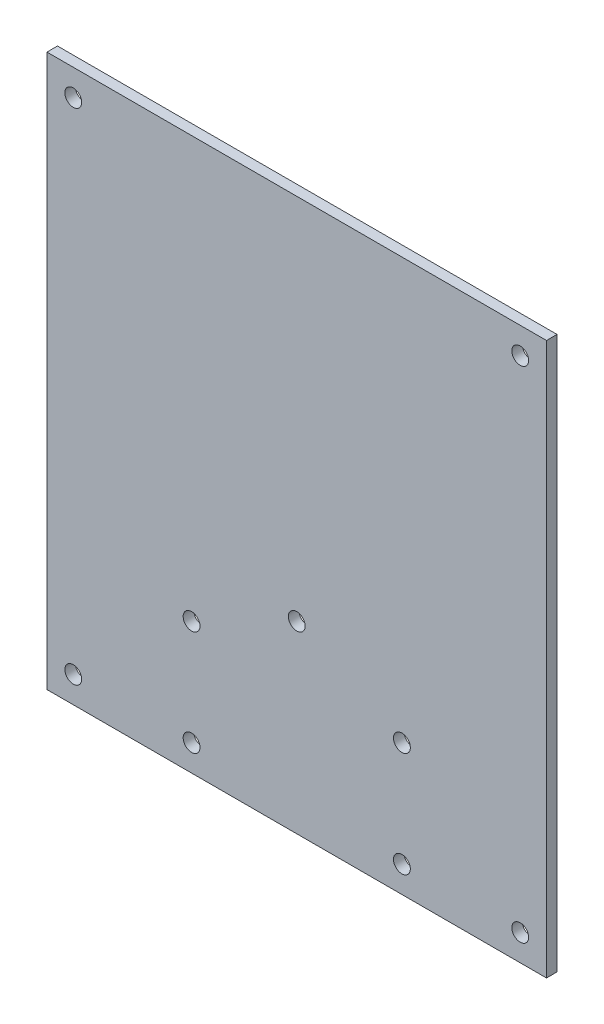
ISO-10303-21;
HEADER;
FILE_DESCRIPTION(('STEP AP214'),'2;1');
FILE_NAME('part.step','',(''),(''),'','','');
FILE_SCHEMA(('AUTOMOTIVE_DESIGN { 1 0 10303 214 1 1 1 1 }'));
ENDSEC;
DATA;
#1=APPLICATION_CONTEXT('core data for automotive mechanical design processes');
#2=APPLICATION_PROTOCOL_DEFINITION('international standard','automotive_design',2000,#1);
#3=PRODUCT_CONTEXT('',#1,'mechanical');
#4=PRODUCT('Part','Part','',(#3));
#5=PRODUCT_RELATED_PRODUCT_CATEGORY('part','',(#4));
#6=PRODUCT_DEFINITION_FORMATION('','',#4);
#7=PRODUCT_DEFINITION_CONTEXT('part definition',#1,'design');
#8=PRODUCT_DEFINITION('design','',#6,#7);
#9=PRODUCT_DEFINITION_SHAPE('','',#8);
#10=(LENGTH_UNIT() NAMED_UNIT(*) SI_UNIT(.MILLI.,.METRE.));
#11=(NAMED_UNIT(*) PLANE_ANGLE_UNIT() SI_UNIT($,.RADIAN.));
#12=(NAMED_UNIT(*) SI_UNIT($,.STERADIAN.) SOLID_ANGLE_UNIT());
#13=UNCERTAINTY_MEASURE_WITH_UNIT(LENGTH_MEASURE(1.E-05),#10,'distance_accuracy_value','');
#14=(GEOMETRIC_REPRESENTATION_CONTEXT(3) GLOBAL_UNCERTAINTY_ASSIGNED_CONTEXT((#13)) GLOBAL_UNIT_ASSIGNED_CONTEXT((#10,
#11,#12)) REPRESENTATION_CONTEXT('',''));
#15=CARTESIAN_POINT('',(0.,0.,0.));
#16=DIRECTION('',(0.,0.,1.));
#17=DIRECTION('',(1.,0.,0.));
#18=AXIS2_PLACEMENT_3D('',#15,#16,#17);
#19=CARTESIAN_POINT('',(-47.5,0.,2.));
#20=DIRECTION('',(-1.,0.,0.));
#21=DIRECTION('',(0.,0.,1.));
#22=AXIS2_PLACEMENT_3D('',#19,#20,#21);
#23=PLANE('',#22);
#24=DIRECTION('',(0.,1.,0.));
#25=VECTOR('',#24,1.);
#26=CARTESIAN_POINT('',(-47.5,0.,0.));
#27=LINE('',#26,#25);
#28=CARTESIAN_POINT('',(-47.5,0.,0.));
#29=VERTEX_POINT('',#28);
#30=CARTESIAN_POINT('',(-47.5,105.,0.));
#31=VERTEX_POINT('',#30);
#32=EDGE_CURVE('E126',#29,#31,#27,.T.);
#33=ORIENTED_EDGE('',*,*,#32,.F.);
#34=DIRECTION('',(0.,0.,-1.));
#35=VECTOR('',#34,1.);
#36=CARTESIAN_POINT('',(-47.5,0.,2.));
#37=LINE('',#36,#35);
#38=CARTESIAN_POINT('',(-47.5,0.,2.));
#39=VERTEX_POINT('',#38);
#40=EDGE_CURVE('E11',#39,#29,#37,.T.);
#41=ORIENTED_EDGE('',*,*,#40,.F.);
#42=DIRECTION('',(0.,1.,0.));
#43=VECTOR('',#42,1.);
#44=CARTESIAN_POINT('',(-47.5,0.,2.));
#45=LINE('',#44,#43);
#46=CARTESIAN_POINT('',(-47.5,105.,2.));
#47=VERTEX_POINT('',#46);
#48=EDGE_CURVE('E84',#39,#47,#45,.T.);
#49=ORIENTED_EDGE('',*,*,#48,.T.);
#50=DIRECTION('',(0.,0.,-1.));
#51=VECTOR('',#50,1.);
#52=CARTESIAN_POINT('',(-47.5,105.,2.));
#53=LINE('',#52,#51);
#54=EDGE_CURVE('E51',#47,#31,#53,.T.);
#55=ORIENTED_EDGE('',*,*,#54,.T.);
#56=EDGE_LOOP('',(#33,#41,#49,#55));
#57=FACE_BOUND('',#56,.T.);
#58=ADVANCED_FACE('F35',(#57),#23,.T.);
#59=CARTESIAN_POINT('',(0.,0.,2.));
#60=DIRECTION('',(0.,1.,0.));
#61=DIRECTION('',(-1.,0.,0.));
#62=AXIS2_PLACEMENT_3D('',#59,#60,#61);
#63=PLANE('',#62);
#64=DIRECTION('',(1.,0.,0.));
#65=VECTOR('',#64,1.);
#66=CARTESIAN_POINT('',(0.,0.,0.));
#67=LINE('',#66,#65);
#68=CARTESIAN_POINT('',(47.5,0.,0.));
#69=VERTEX_POINT('',#68);
#70=EDGE_CURVE('E90',#29,#69,#67,.T.);
#71=ORIENTED_EDGE('',*,*,#70,.T.);
#72=DIRECTION('',(0.,0.,-1.));
#73=VECTOR('',#72,1.);
#74=CARTESIAN_POINT('',(47.5,0.,2.));
#75=LINE('',#74,#73);
#76=CARTESIAN_POINT('',(47.5,0.,2.));
#77=VERTEX_POINT('',#76);
#78=EDGE_CURVE('E43',#77,#69,#75,.T.);
#79=ORIENTED_EDGE('',*,*,#78,.F.);
#80=DIRECTION('',(1.,0.,0.));
#81=VECTOR('',#80,1.);
#82=CARTESIAN_POINT('',(0.,0.,2.));
#83=LINE('',#82,#81);
#84=EDGE_CURVE('E77',#39,#77,#83,.T.);
#85=ORIENTED_EDGE('',*,*,#84,.F.);
#86=ORIENTED_EDGE('',*,*,#40,.T.);
#87=EDGE_LOOP('',(#71,#79,#85,#86));
#88=FACE_BOUND('',#87,.T.);
#89=ADVANCED_FACE('F88',(#88),#63,.F.);
#90=CARTESIAN_POINT('',(47.5,0.,2.));
#91=DIRECTION('',(1.,0.,0.));
#92=DIRECTION('',(0.,0.,-1.));
#93=AXIS2_PLACEMENT_3D('',#90,#91,#92);
#94=PLANE('',#93);
#95=DIRECTION('',(0.,-1.,0.));
#96=VECTOR('',#95,1.);
#97=CARTESIAN_POINT('',(47.5,0.,0.));
#98=LINE('',#97,#96);
#99=CARTESIAN_POINT('',(47.5,105.,0.));
#100=VERTEX_POINT('',#99);
#101=EDGE_CURVE('E129',#100,#69,#98,.T.);
#102=ORIENTED_EDGE('',*,*,#101,.F.);
#103=DIRECTION('',(0.,0.,-1.));
#104=VECTOR('',#103,1.);
#105=CARTESIAN_POINT('',(47.5,105.,2.));
#106=LINE('',#105,#104);
#107=CARTESIAN_POINT('',(47.5,105.,2.));
#108=VERTEX_POINT('',#107);
#109=EDGE_CURVE('E64',#108,#100,#106,.T.);
#110=ORIENTED_EDGE('',*,*,#109,.F.);
#111=DIRECTION('',(0.,-1.,0.));
#112=VECTOR('',#111,1.);
#113=CARTESIAN_POINT('',(47.5,0.,2.));
#114=LINE('',#113,#112);
#115=EDGE_CURVE('E83',#108,#77,#114,.T.);
#116=ORIENTED_EDGE('',*,*,#115,.T.);
#117=ORIENTED_EDGE('',*,*,#78,.T.);
#118=EDGE_LOOP('',(#102,#110,#116,#117));
#119=FACE_BOUND('',#118,.T.);
#120=ADVANCED_FACE('F93',(#119),#94,.T.);
#121=CARTESIAN_POINT('',(20.,5.,2.));
#122=DIRECTION('',(0.,0.,-1.));
#123=DIRECTION('',(-1.,0.,0.));
#124=AXIS2_PLACEMENT_3D('',#121,#122,#123);
#125=CYLINDRICAL_SURFACE('',#124,1.6);
#126=CARTESIAN_POINT('',(20.,5.,2.));
#127=DIRECTION('',(0.,0.,1.));
#128=DIRECTION('',(1.,0.,0.));
#129=AXIS2_PLACEMENT_3D('',#126,#127,#128);
#130=CIRCLE('',#129,1.6);
#131=CARTESIAN_POINT('',(21.6,5.,2.));
#132=VERTEX_POINT('',#131);
#133=EDGE_CURVE('E120',#132,#132,#130,.T.);
#134=ORIENTED_EDGE('',*,*,#133,.T.);
#135=EDGE_LOOP('',(#134));
#136=FACE_BOUND('',#135,.T.);
#137=CARTESIAN_POINT('',(20.,5.,0.));
#138=DIRECTION('',(0.,0.,1.));
#139=DIRECTION('',(1.,0.,0.));
#140=AXIS2_PLACEMENT_3D('',#137,#138,#139);
#141=CIRCLE('',#140,1.6);
#142=CARTESIAN_POINT('',(21.6,5.,0.));
#143=VERTEX_POINT('',#142);
#144=EDGE_CURVE('E155',#143,#143,#141,.T.);
#145=ORIENTED_EDGE('',*,*,#144,.F.);
#146=EDGE_LOOP('',(#145));
#147=FACE_BOUND('',#146,.T.);
#148=ADVANCED_FACE('F186',(#136,#147),#125,.F.);
#149=CARTESIAN_POINT('',(-20.,25.,2.));
#150=DIRECTION('',(0.,0.,-1.));
#151=DIRECTION('',(-1.,0.,0.));
#152=AXIS2_PLACEMENT_3D('',#149,#150,#151);
#153=CYLINDRICAL_SURFACE('',#152,1.6);
#154=CARTESIAN_POINT('',(-20.,25.,2.));
#155=DIRECTION('',(0.,0.,1.));
#156=DIRECTION('',(1.,0.,0.));
#157=AXIS2_PLACEMENT_3D('',#154,#155,#156);
#158=CIRCLE('',#157,1.6);
#159=CARTESIAN_POINT('',(-18.4,25.,2.));
#160=VERTEX_POINT('',#159);
#161=EDGE_CURVE('E117',#160,#160,#158,.T.);
#162=ORIENTED_EDGE('',*,*,#161,.T.);
#163=EDGE_LOOP('',(#162));
#164=FACE_BOUND('',#163,.T.);
#165=CARTESIAN_POINT('',(-20.,25.,0.));
#166=DIRECTION('',(0.,0.,1.));
#167=DIRECTION('',(1.,0.,0.));
#168=AXIS2_PLACEMENT_3D('',#165,#166,#167);
#169=CIRCLE('',#168,1.6);
#170=CARTESIAN_POINT('',(-18.4,25.,0.));
#171=VERTEX_POINT('',#170);
#172=EDGE_CURVE('E152',#171,#171,#169,.T.);
#173=ORIENTED_EDGE('',*,*,#172,.F.);
#174=EDGE_LOOP('',(#173));
#175=FACE_BOUND('',#174,.T.);
#176=ADVANCED_FACE('F190',(#164,#175),#153,.F.);
#177=CARTESIAN_POINT('',(20.,25.,2.));
#178=DIRECTION('',(0.,0.,-1.));
#179=DIRECTION('',(-1.,0.,0.));
#180=AXIS2_PLACEMENT_3D('',#177,#178,#179);
#181=CYLINDRICAL_SURFACE('',#180,1.6);
#182=CARTESIAN_POINT('',(20.,25.,2.));
#183=DIRECTION('',(0.,0.,1.));
#184=DIRECTION('',(1.,0.,0.));
#185=AXIS2_PLACEMENT_3D('',#182,#183,#184);
#186=CIRCLE('',#185,1.6);
#187=CARTESIAN_POINT('',(21.6,25.,2.));
#188=VERTEX_POINT('',#187);
#189=EDGE_CURVE('E114',#188,#188,#186,.F.);
#190=ORIENTED_EDGE('',*,*,#189,.F.);
#191=EDGE_LOOP('',(#190));
#192=FACE_BOUND('',#191,.T.);
#193=CARTESIAN_POINT('',(20.,25.,0.));
#194=DIRECTION('',(0.,0.,1.));
#195=DIRECTION('',(1.,0.,0.));
#196=AXIS2_PLACEMENT_3D('',#193,#194,#195);
#197=CIRCLE('',#196,1.6);
#198=CARTESIAN_POINT('',(21.6,25.,0.));
#199=VERTEX_POINT('',#198);
#200=EDGE_CURVE('E149',#199,#199,#197,.F.);
#201=ORIENTED_EDGE('',*,*,#200,.T.);
#202=EDGE_LOOP('',(#201));
#203=FACE_BOUND('',#202,.T.);
#204=ADVANCED_FACE('F196',(#192,#203),#181,.F.);
#205=CARTESIAN_POINT('',(-42.5,5.,2.));
#206=DIRECTION('',(0.,0.,-1.));
#207=DIRECTION('',(-1.,0.,0.));
#208=AXIS2_PLACEMENT_3D('',#205,#206,#207);
#209=CYLINDRICAL_SURFACE('',#208,1.6);
#210=CARTESIAN_POINT('',(-42.5,5.,2.));
#211=DIRECTION('',(0.,0.,1.));
#212=DIRECTION('',(1.,0.,0.));
#213=AXIS2_PLACEMENT_3D('',#210,#211,#212);
#214=CIRCLE('',#213,1.6);
#215=CARTESIAN_POINT('',(-40.9,5.,2.));
#216=VERTEX_POINT('',#215);
#217=EDGE_CURVE('E111',#216,#216,#214,.F.);
#218=ORIENTED_EDGE('',*,*,#217,.F.);
#219=EDGE_LOOP('',(#218));
#220=FACE_BOUND('',#219,.T.);
#221=CARTESIAN_POINT('',(-42.5,5.,0.));
#222=DIRECTION('',(0.,0.,1.));
#223=DIRECTION('',(1.,0.,0.));
#224=AXIS2_PLACEMENT_3D('',#221,#222,#223);
#225=CIRCLE('',#224,1.6);
#226=CARTESIAN_POINT('',(-40.9,5.,0.));
#227=VERTEX_POINT('',#226);
#228=EDGE_CURVE('E146',#227,#227,#225,.F.);
#229=ORIENTED_EDGE('',*,*,#228,.T.);
#230=EDGE_LOOP('',(#229));
#231=FACE_BOUND('',#230,.T.);
#232=ADVANCED_FACE('F204',(#220,#231),#209,.F.);
#233=CARTESIAN_POINT('',(42.5,5.,2.));
#234=DIRECTION('',(0.,0.,-1.));
#235=DIRECTION('',(-1.,0.,0.));
#236=AXIS2_PLACEMENT_3D('',#233,#234,#235);
#237=CYLINDRICAL_SURFACE('',#236,1.6);
#238=CARTESIAN_POINT('',(42.5,5.,2.));
#239=DIRECTION('',(0.,0.,1.));
#240=DIRECTION('',(1.,0.,0.));
#241=AXIS2_PLACEMENT_3D('',#238,#239,#240);
#242=CIRCLE('',#241,1.6);
#243=CARTESIAN_POINT('',(44.1,5.,2.));
#244=VERTEX_POINT('',#243);
#245=EDGE_CURVE('E108',#244,#244,#242,.T.);
#246=ORIENTED_EDGE('',*,*,#245,.T.);
#247=EDGE_LOOP('',(#246));
#248=FACE_BOUND('',#247,.T.);
#249=CARTESIAN_POINT('',(42.5,5.,0.));
#250=DIRECTION('',(0.,0.,1.));
#251=DIRECTION('',(1.,0.,0.));
#252=AXIS2_PLACEMENT_3D('',#249,#250,#251);
#253=CIRCLE('',#252,1.6);
#254=CARTESIAN_POINT('',(44.1,5.,0.));
#255=VERTEX_POINT('',#254);
#256=EDGE_CURVE('E143',#255,#255,#253,.T.);
#257=ORIENTED_EDGE('',*,*,#256,.F.);
#258=EDGE_LOOP('',(#257));
#259=FACE_BOUND('',#258,.T.);
#260=ADVANCED_FACE('F208',(#248,#259),#237,.F.);
#261=CARTESIAN_POINT('',(42.5,100.,2.));
#262=DIRECTION('',(0.,0.,-1.));
#263=DIRECTION('',(-1.,0.,0.));
#264=AXIS2_PLACEMENT_3D('',#261,#262,#263);
#265=CYLINDRICAL_SURFACE('',#264,1.6);
#266=CARTESIAN_POINT('',(42.5,100.,2.));
#267=DIRECTION('',(0.,0.,1.));
#268=DIRECTION('',(1.,0.,0.));
#269=AXIS2_PLACEMENT_3D('',#266,#267,#268);
#270=CIRCLE('',#269,1.6);
#271=CARTESIAN_POINT('',(44.1,100.,2.));
#272=VERTEX_POINT('',#271);
#273=EDGE_CURVE('E105',#272,#272,#270,.F.);
#274=ORIENTED_EDGE('',*,*,#273,.F.);
#275=EDGE_LOOP('',(#274));
#276=FACE_BOUND('',#275,.T.);
#277=CARTESIAN_POINT('',(42.5,100.,0.));
#278=DIRECTION('',(0.,0.,1.));
#279=DIRECTION('',(1.,0.,0.));
#280=AXIS2_PLACEMENT_3D('',#277,#278,#279);
#281=CIRCLE('',#280,1.6);
#282=CARTESIAN_POINT('',(44.1,100.,0.));
#283=VERTEX_POINT('',#282);
#284=EDGE_CURVE('E140',#283,#283,#281,.F.);
#285=ORIENTED_EDGE('',*,*,#284,.T.);
#286=EDGE_LOOP('',(#285));
#287=FACE_BOUND('',#286,.T.);
#288=ADVANCED_FACE('F212',(#276,#287),#265,.F.);
#289=CARTESIAN_POINT('',(-42.5,100.,2.));
#290=DIRECTION('',(0.,0.,-1.));
#291=DIRECTION('',(-1.,0.,0.));
#292=AXIS2_PLACEMENT_3D('',#289,#290,#291);
#293=CYLINDRICAL_SURFACE('',#292,1.6);
#294=CARTESIAN_POINT('',(-42.5,100.,2.));
#295=DIRECTION('',(0.,0.,1.));
#296=DIRECTION('',(1.,0.,0.));
#297=AXIS2_PLACEMENT_3D('',#294,#295,#296);
#298=CIRCLE('',#297,1.6);
#299=CARTESIAN_POINT('',(-40.9,100.,2.));
#300=VERTEX_POINT('',#299);
#301=EDGE_CURVE('E102',#300,#300,#298,.T.);
#302=ORIENTED_EDGE('',*,*,#301,.T.);
#303=EDGE_LOOP('',(#302));
#304=FACE_BOUND('',#303,.T.);
#305=CARTESIAN_POINT('',(-42.5,100.,0.));
#306=DIRECTION('',(0.,0.,1.));
#307=DIRECTION('',(1.,0.,0.));
#308=AXIS2_PLACEMENT_3D('',#305,#306,#307);
#309=CIRCLE('',#308,1.6);
#310=CARTESIAN_POINT('',(-40.9,100.,0.));
#311=VERTEX_POINT('',#310);
#312=EDGE_CURVE('E137',#311,#311,#309,.T.);
#313=ORIENTED_EDGE('',*,*,#312,.F.);
#314=EDGE_LOOP('',(#313));
#315=FACE_BOUND('',#314,.T.);
#316=ADVANCED_FACE('F175',(#304,#315),#293,.F.);
#317=CARTESIAN_POINT('',(0.,35.,2.));
#318=DIRECTION('',(0.,0.,-1.));
#319=DIRECTION('',(-1.,0.,0.));
#320=AXIS2_PLACEMENT_3D('',#317,#318,#319);
#321=CYLINDRICAL_SURFACE('',#320,1.6);
#322=CARTESIAN_POINT('',(0.,35.,2.));
#323=DIRECTION('',(0.,0.,1.));
#324=DIRECTION('',(1.,0.,0.));
#325=AXIS2_PLACEMENT_3D('',#322,#323,#324);
#326=CIRCLE('',#325,1.6);
#327=CARTESIAN_POINT('',(1.6,35.,2.));
#328=VERTEX_POINT('',#327);
#329=EDGE_CURVE('E96',#328,#328,#326,.T.);
#330=ORIENTED_EDGE('',*,*,#329,.T.);
#331=EDGE_LOOP('',(#330));
#332=FACE_BOUND('',#331,.T.);
#333=CARTESIAN_POINT('',(0.,35.,0.));
#334=DIRECTION('',(0.,0.,1.));
#335=DIRECTION('',(1.,0.,0.));
#336=AXIS2_PLACEMENT_3D('',#333,#334,#335);
#337=CIRCLE('',#336,1.6);
#338=CARTESIAN_POINT('',(1.6,35.,0.));
#339=VERTEX_POINT('',#338);
#340=EDGE_CURVE('E134',#339,#339,#337,.T.);
#341=ORIENTED_EDGE('',*,*,#340,.F.);
#342=EDGE_LOOP('',(#341));
#343=FACE_BOUND('',#342,.T.);
#344=ADVANCED_FACE('F167',(#332,#343),#321,.F.);
#345=CARTESIAN_POINT('',(0.,105.,2.));
#346=DIRECTION('',(0.,1.,0.));
#347=DIRECTION('',(0.,0.,1.));
#348=AXIS2_PLACEMENT_3D('',#345,#346,#347);
#349=PLANE('',#348);
#350=DIRECTION('',(1.,0.,0.));
#351=VECTOR('',#350,1.);
#352=CARTESIAN_POINT('',(0.,105.,0.));
#353=LINE('',#352,#351);
#354=EDGE_CURVE('E131',#31,#100,#353,.T.);
#355=ORIENTED_EDGE('',*,*,#354,.F.);
#356=ORIENTED_EDGE('',*,*,#54,.F.);
#357=DIRECTION('',(1.,0.,0.));
#358=VECTOR('',#357,1.);
#359=CARTESIAN_POINT('',(0.,105.,2.));
#360=LINE('',#359,#358);
#361=EDGE_CURVE('E94',#47,#108,#360,.T.);
#362=ORIENTED_EDGE('',*,*,#361,.T.);
#363=ORIENTED_EDGE('',*,*,#109,.T.);
#364=EDGE_LOOP('',(#355,#356,#362,#363));
#365=FACE_BOUND('',#364,.T.);
#366=ADVANCED_FACE('F164',(#365),#349,.T.);
#367=CARTESIAN_POINT('',(-20.,5.,2.));
#368=DIRECTION('',(0.,0.,-1.));
#369=DIRECTION('',(-1.,0.,0.));
#370=AXIS2_PLACEMENT_3D('',#367,#368,#369);
#371=CYLINDRICAL_SURFACE('',#370,1.6);
#372=CARTESIAN_POINT('',(-20.,5.,2.));
#373=DIRECTION('',(0.,0.,1.));
#374=DIRECTION('',(1.,0.,0.));
#375=AXIS2_PLACEMENT_3D('',#372,#373,#374);
#376=CIRCLE('',#375,1.6);
#377=CARTESIAN_POINT('',(-18.4,5.,2.));
#378=VERTEX_POINT('',#377);
#379=EDGE_CURVE('E123',#378,#378,#376,.F.);
#380=ORIENTED_EDGE('',*,*,#379,.F.);
#381=EDGE_LOOP('',(#380));
#382=FACE_BOUND('',#381,.T.);
#383=CARTESIAN_POINT('',(-20.,5.,0.));
#384=DIRECTION('',(0.,0.,1.));
#385=DIRECTION('',(1.,0.,0.));
#386=AXIS2_PLACEMENT_3D('',#383,#384,#385);
#387=CIRCLE('',#386,1.6);
#388=CARTESIAN_POINT('',(-18.4,5.,0.));
#389=VERTEX_POINT('',#388);
#390=EDGE_CURVE('E158',#389,#389,#387,.F.);
#391=ORIENTED_EDGE('',*,*,#390,.T.);
#392=EDGE_LOOP('',(#391));
#393=FACE_BOUND('',#392,.T.);
#394=ADVANCED_FACE('F166',(#382,#393),#371,.F.);
#395=CARTESIAN_POINT('',(0.,0.,2.));
#396=DIRECTION('',(0.,0.,1.));
#397=DIRECTION('',(1.,0.,0.));
#398=AXIS2_PLACEMENT_3D('',#395,#396,#397);
#399=PLANE('',#398);
#400=ORIENTED_EDGE('',*,*,#48,.F.);
#401=ORIENTED_EDGE('',*,*,#84,.T.);
#402=ORIENTED_EDGE('',*,*,#115,.F.);
#403=ORIENTED_EDGE('',*,*,#361,.F.);
#404=EDGE_LOOP('',(#400,#401,#402,#403));
#405=FACE_BOUND('',#404,.T.);
#406=ORIENTED_EDGE('',*,*,#329,.F.);
#407=EDGE_LOOP('',(#406));
#408=FACE_BOUND('',#407,.T.);
#409=ORIENTED_EDGE('',*,*,#301,.F.);
#410=EDGE_LOOP('',(#409));
#411=FACE_BOUND('',#410,.T.);
#412=ORIENTED_EDGE('',*,*,#273,.T.);
#413=EDGE_LOOP('',(#412));
#414=FACE_BOUND('',#413,.T.);
#415=ORIENTED_EDGE('',*,*,#245,.F.);
#416=EDGE_LOOP('',(#415));
#417=FACE_BOUND('',#416,.T.);
#418=ORIENTED_EDGE('',*,*,#217,.T.);
#419=EDGE_LOOP('',(#418));
#420=FACE_BOUND('',#419,.T.);
#421=ORIENTED_EDGE('',*,*,#189,.T.);
#422=EDGE_LOOP('',(#421));
#423=FACE_BOUND('',#422,.T.);
#424=ORIENTED_EDGE('',*,*,#161,.F.);
#425=EDGE_LOOP('',(#424));
#426=FACE_BOUND('',#425,.T.);
#427=ORIENTED_EDGE('',*,*,#133,.F.);
#428=EDGE_LOOP('',(#427));
#429=FACE_BOUND('',#428,.T.);
#430=ORIENTED_EDGE('',*,*,#379,.T.);
#431=EDGE_LOOP('',(#430));
#432=FACE_BOUND('',#431,.T.);
#433=ADVANCED_FACE('F79',(#405,#408,#411,#414,#417,#420,#423,#426,#429,#432),#399,.T.);
#434=CARTESIAN_POINT('',(0.,0.,0.));
#435=DIRECTION('',(0.,0.,1.));
#436=DIRECTION('',(1.,0.,0.));
#437=AXIS2_PLACEMENT_3D('',#434,#435,#436);
#438=PLANE('',#437);
#439=ORIENTED_EDGE('',*,*,#32,.T.);
#440=ORIENTED_EDGE('',*,*,#354,.T.);
#441=ORIENTED_EDGE('',*,*,#101,.T.);
#442=ORIENTED_EDGE('',*,*,#70,.F.);
#443=EDGE_LOOP('',(#439,#440,#441,#442));
#444=FACE_BOUND('',#443,.T.);
#445=ORIENTED_EDGE('',*,*,#340,.T.);
#446=EDGE_LOOP('',(#445));
#447=FACE_BOUND('',#446,.T.);
#448=ORIENTED_EDGE('',*,*,#312,.T.);
#449=EDGE_LOOP('',(#448));
#450=FACE_BOUND('',#449,.T.);
#451=ORIENTED_EDGE('',*,*,#284,.F.);
#452=EDGE_LOOP('',(#451));
#453=FACE_BOUND('',#452,.T.);
#454=ORIENTED_EDGE('',*,*,#256,.T.);
#455=EDGE_LOOP('',(#454));
#456=FACE_BOUND('',#455,.T.);
#457=ORIENTED_EDGE('',*,*,#228,.F.);
#458=EDGE_LOOP('',(#457));
#459=FACE_BOUND('',#458,.T.);
#460=ORIENTED_EDGE('',*,*,#200,.F.);
#461=EDGE_LOOP('',(#460));
#462=FACE_BOUND('',#461,.T.);
#463=ORIENTED_EDGE('',*,*,#172,.T.);
#464=EDGE_LOOP('',(#463));
#465=FACE_BOUND('',#464,.T.);
#466=ORIENTED_EDGE('',*,*,#144,.T.);
#467=EDGE_LOOP('',(#466));
#468=FACE_BOUND('',#467,.T.);
#469=ORIENTED_EDGE('',*,*,#390,.F.);
#470=EDGE_LOOP('',(#469));
#471=FACE_BOUND('',#470,.T.);
#472=ADVANCED_FACE('F225',(#444,#447,#450,#453,#456,#459,#462,#465,#468,#471),#438,.F.);
#473=CLOSED_SHELL('',(#58,#89,#120,#148,#176,#204,#232,#260,#288,#316,#344,#366,#394,#433,#472));
#474=MANIFOLD_SOLID_BREP('B2',#473);
#475=ADVANCED_BREP_SHAPE_REPRESENTATION('',(#18,#474),#14);
#476=SHAPE_DEFINITION_REPRESENTATION(#9,#475);
ENDSEC;
END-ISO-10303-21;
